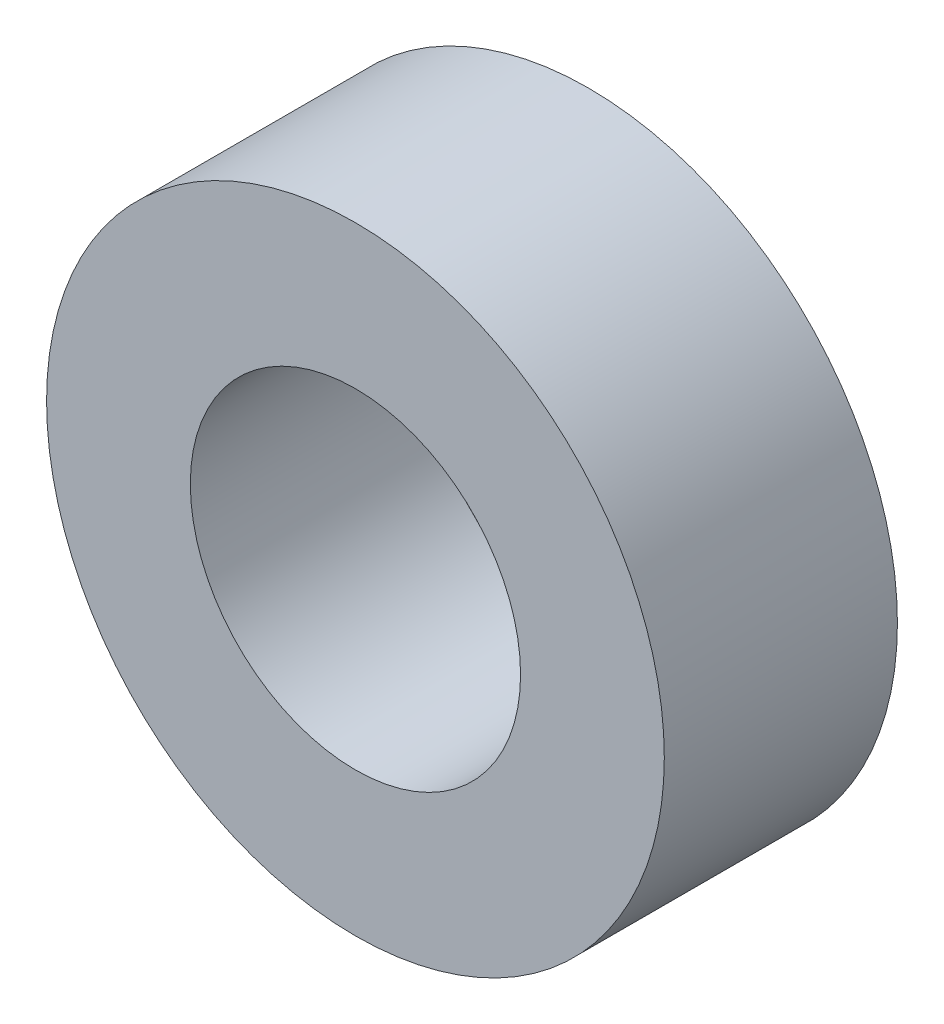
ISO-10303-21;
HEADER;
FILE_DESCRIPTION(('STEP AP214'),'2;1');
FILE_NAME('part.step','',(''),(''),'','','');
FILE_SCHEMA(('AUTOMOTIVE_DESIGN { 1 0 10303 214 1 1 1 1 }'));
ENDSEC;
DATA;
#1=APPLICATION_CONTEXT('core data for automotive mechanical design processes');
#2=APPLICATION_PROTOCOL_DEFINITION('international standard','automotive_design',2000,#1);
#3=PRODUCT_CONTEXT('',#1,'mechanical');
#4=PRODUCT('Part','Part','',(#3));
#5=PRODUCT_RELATED_PRODUCT_CATEGORY('part','',(#4));
#6=PRODUCT_DEFINITION_FORMATION('','',#4);
#7=PRODUCT_DEFINITION_CONTEXT('part definition',#1,'design');
#8=PRODUCT_DEFINITION('design','',#6,#7);
#9=PRODUCT_DEFINITION_SHAPE('','',#8);
#10=(LENGTH_UNIT() NAMED_UNIT(*) SI_UNIT(.MILLI.,.METRE.));
#11=(NAMED_UNIT(*) PLANE_ANGLE_UNIT() SI_UNIT($,.RADIAN.));
#12=(NAMED_UNIT(*) SI_UNIT($,.STERADIAN.) SOLID_ANGLE_UNIT());
#13=UNCERTAINTY_MEASURE_WITH_UNIT(LENGTH_MEASURE(1.E-05),#10,'distance_accuracy_value','');
#14=(GEOMETRIC_REPRESENTATION_CONTEXT(3) GLOBAL_UNCERTAINTY_ASSIGNED_CONTEXT((#13)) GLOBAL_UNIT_ASSIGNED_CONTEXT((#10,
#11,#12)) REPRESENTATION_CONTEXT('',''));
#15=CARTESIAN_POINT('',(0.,0.,0.));
#16=DIRECTION('',(0.,0.,1.));
#17=DIRECTION('',(1.,0.,0.));
#18=AXIS2_PLACEMENT_3D('',#15,#16,#17);
#19=CARTESIAN_POINT('',(160.,-24.,110.));
#20=DIRECTION('',(0.,0.,1.));
#21=DIRECTION('',(1.,0.,0.));
#22=AXIS2_PLACEMENT_3D('',#19,#20,#21);
#23=PLANE('',#22);
#24=CARTESIAN_POINT('',(160.,-24.,110.));
#25=DIRECTION('',(0.,0.,1.));
#26=DIRECTION('',(1.,0.,0.));
#27=AXIS2_PLACEMENT_3D('',#24,#25,#26);
#28=CIRCLE('',#27,1.7);
#29=CARTESIAN_POINT('',(161.7,-24.,110.));
#30=VERTEX_POINT('',#29);
#31=EDGE_CURVE('E25',#30,#30,#28,.T.);
#32=ORIENTED_EDGE('',*,*,#31,.F.);
#33=EDGE_LOOP('',(#32));
#34=FACE_BOUND('',#33,.T.);
#35=CARTESIAN_POINT('',(160.,-24.,110.));
#36=DIRECTION('',(0.,0.,-1.));
#37=DIRECTION('',(-1.,0.,0.));
#38=AXIS2_PLACEMENT_3D('',#35,#36,#37);
#39=CIRCLE('',#38,3.18);
#40=CARTESIAN_POINT('',(156.82,-24.,110.));
#41=VERTEX_POINT('',#40);
#42=EDGE_CURVE('E9',#41,#41,#39,.T.);
#43=ORIENTED_EDGE('',*,*,#42,.F.);
#44=EDGE_LOOP('',(#43));
#45=FACE_BOUND('',#44,.T.);
#46=ADVANCED_FACE('F13',(#34,#45),#23,.T.);
#47=CARTESIAN_POINT('',(160.,-24.,107.6));
#48=DIRECTION('',(0.,0.,-1.));
#49=DIRECTION('',(-1.,0.,0.));
#50=AXIS2_PLACEMENT_3D('',#47,#48,#49);
#51=PLANE('',#50);
#52=CARTESIAN_POINT('',(160.,-24.,107.6));
#53=DIRECTION('',(0.,0.,-1.));
#54=DIRECTION('',(-1.,0.,0.));
#55=AXIS2_PLACEMENT_3D('',#52,#53,#54);
#56=CIRCLE('',#55,1.7);
#57=CARTESIAN_POINT('',(158.3,-24.,107.6));
#58=VERTEX_POINT('',#57);
#59=EDGE_CURVE('E17',#58,#58,#56,.T.);
#60=ORIENTED_EDGE('',*,*,#59,.F.);
#61=EDGE_LOOP('',(#60));
#62=FACE_BOUND('',#61,.T.);
#63=CARTESIAN_POINT('',(160.,-24.,107.6));
#64=DIRECTION('',(0.,0.,1.));
#65=DIRECTION('',(1.,0.,0.));
#66=AXIS2_PLACEMENT_3D('',#63,#64,#65);
#67=CIRCLE('',#66,3.18);
#68=CARTESIAN_POINT('',(163.18,-24.,107.6));
#69=VERTEX_POINT('',#68);
#70=EDGE_CURVE('E21',#69,#69,#67,.T.);
#71=ORIENTED_EDGE('',*,*,#70,.F.);
#72=EDGE_LOOP('',(#71));
#73=FACE_BOUND('',#72,.T.);
#74=ADVANCED_FACE('F36',(#62,#73),#51,.T.);
#75=CARTESIAN_POINT('',(160.,-24.,107.6));
#76=DIRECTION('',(0.,0.,1.));
#77=DIRECTION('',(1.,0.,0.));
#78=AXIS2_PLACEMENT_3D('',#75,#76,#77);
#79=CYLINDRICAL_SURFACE('',#78,3.18);
#80=ORIENTED_EDGE('',*,*,#42,.T.);
#81=EDGE_LOOP('',(#80));
#82=FACE_BOUND('',#81,.T.);
#83=ORIENTED_EDGE('',*,*,#70,.T.);
#84=EDGE_LOOP('',(#83));
#85=FACE_BOUND('',#84,.T.);
#86=ADVANCED_FACE('F15',(#82,#85),#79,.T.);
#87=CARTESIAN_POINT('',(160.,-24.,107.));
#88=DIRECTION('',(0.,0.,1.));
#89=DIRECTION('',(1.,0.,0.));
#90=AXIS2_PLACEMENT_3D('',#87,#88,#89);
#91=CYLINDRICAL_SURFACE('',#90,1.7);
#92=ORIENTED_EDGE('',*,*,#31,.T.);
#93=EDGE_LOOP('',(#92));
#94=FACE_BOUND('',#93,.T.);
#95=ORIENTED_EDGE('',*,*,#59,.T.);
#96=EDGE_LOOP('',(#95));
#97=FACE_BOUND('',#96,.T.);
#98=ADVANCED_FACE('F34',(#94,#97),#91,.F.);
#99=CLOSED_SHELL('',(#46,#74,#86,#98));
#100=MANIFOLD_SOLID_BREP('B1',#99);
#101=ADVANCED_BREP_SHAPE_REPRESENTATION('',(#18,#100),#14);
#102=SHAPE_DEFINITION_REPRESENTATION(#9,#101);
ENDSEC;
END-ISO-10303-21;
